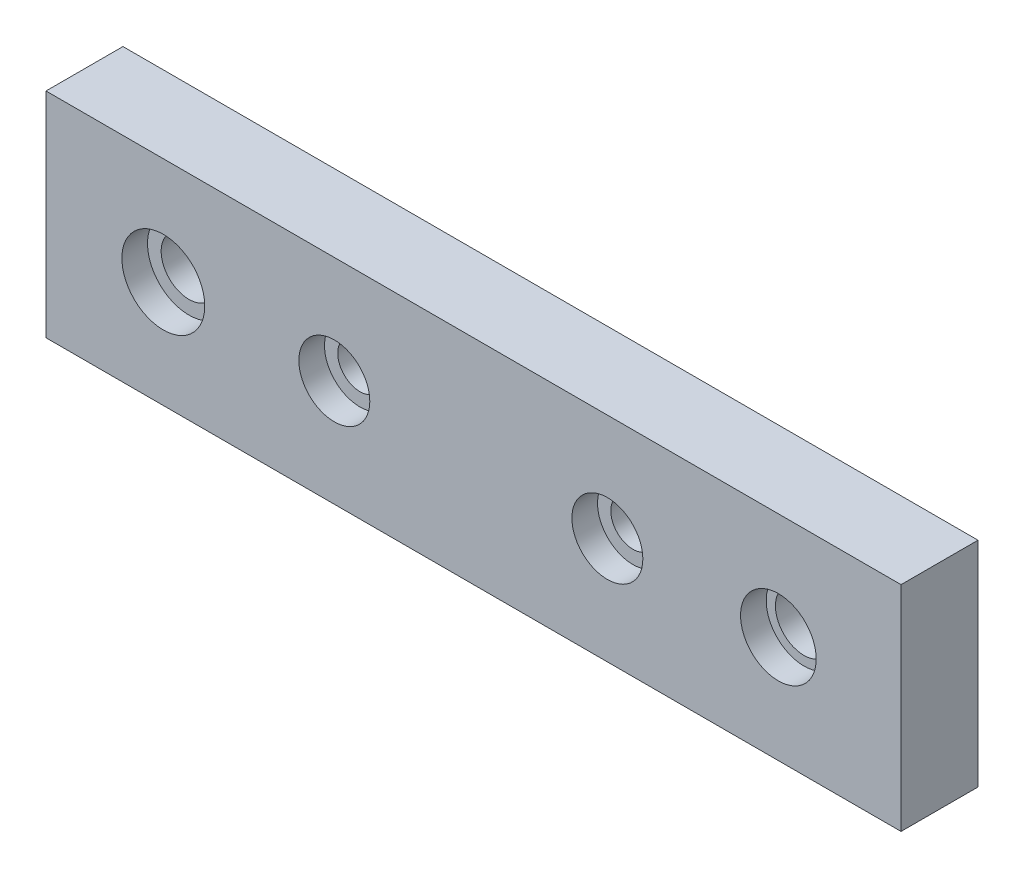
ISO-10303-21;
HEADER;
FILE_DESCRIPTION(('STEP AP214'),'2;1');
FILE_NAME('part.step','',(''),(''),'','','');
FILE_SCHEMA(('AUTOMOTIVE_DESIGN { 1 0 10303 214 1 1 1 1 }'));
ENDSEC;
DATA;
#1=APPLICATION_CONTEXT('core data for automotive mechanical design processes');
#2=APPLICATION_PROTOCOL_DEFINITION('international standard','automotive_design',2000,#1);
#3=PRODUCT_CONTEXT('',#1,'mechanical');
#4=PRODUCT('Part','Part','',(#3));
#5=PRODUCT_RELATED_PRODUCT_CATEGORY('part','',(#4));
#6=PRODUCT_DEFINITION_FORMATION('','',#4);
#7=PRODUCT_DEFINITION_CONTEXT('part definition',#1,'design');
#8=PRODUCT_DEFINITION('design','',#6,#7);
#9=PRODUCT_DEFINITION_SHAPE('','',#8);
#10=(LENGTH_UNIT() NAMED_UNIT(*) SI_UNIT(.MILLI.,.METRE.));
#11=(NAMED_UNIT(*) PLANE_ANGLE_UNIT() SI_UNIT($,.RADIAN.));
#12=(NAMED_UNIT(*) SI_UNIT($,.STERADIAN.) SOLID_ANGLE_UNIT());
#13=UNCERTAINTY_MEASURE_WITH_UNIT(LENGTH_MEASURE(1.E-05),#10,'distance_accuracy_value','');
#14=(GEOMETRIC_REPRESENTATION_CONTEXT(3) GLOBAL_UNCERTAINTY_ASSIGNED_CONTEXT((#13)) GLOBAL_UNIT_ASSIGNED_CONTEXT((#10,
#11,#12)) REPRESENTATION_CONTEXT('',''));
#15=CARTESIAN_POINT('',(0.,0.,0.));
#16=DIRECTION('',(0.,0.,1.));
#17=DIRECTION('',(1.,0.,0.));
#18=AXIS2_PLACEMENT_3D('',#15,#16,#17);
#19=CARTESIAN_POINT('',(-85.3473640143417,12.5,-75.));
#20=DIRECTION('',(0.,0.,1.));
#21=DIRECTION('',(1.,0.,0.));
#22=AXIS2_PLACEMENT_3D('',#19,#20,#21);
#23=CYLINDRICAL_SURFACE('',#22,3.34609875630122);
#24=CARTESIAN_POINT('',(-85.3473640143417,12.5,17.5));
#25=DIRECTION('',(0.,0.,1.));
#26=DIRECTION('',(1.,0.,0.));
#27=AXIS2_PLACEMENT_3D('',#24,#25,#26);
#28=CIRCLE('',#27,3.34609875630122);
#29=CARTESIAN_POINT('',(-82.0012652580405,12.5,17.5));
#30=VERTEX_POINT('',#29);
#31=EDGE_CURVE('E108',#30,#30,#28,.T.);
#32=ORIENTED_EDGE('',*,*,#31,.F.);
#33=EDGE_LOOP('',(#32));
#34=FACE_BOUND('',#33,.T.);
#35=CARTESIAN_POINT('',(-85.3473640143417,12.5,23.5));
#36=DIRECTION('',(0.,0.,1.));
#37=DIRECTION('',(1.,0.,0.));
#38=AXIS2_PLACEMENT_3D('',#35,#36,#37);
#39=CIRCLE('',#38,3.34609875630122);
#40=CARTESIAN_POINT('',(-82.0012652580405,12.5,23.5));
#41=VERTEX_POINT('',#40);
#42=EDGE_CURVE('E36',#41,#41,#39,.F.);
#43=ORIENTED_EDGE('',*,*,#42,.F.);
#44=EDGE_LOOP('',(#43));
#45=FACE_BOUND('',#44,.T.);
#46=ADVANCED_FACE('F32',(#34,#45),#23,.F.);
#47=CARTESIAN_POINT('',(-157.28059455583,12.5,-75.));
#48=DIRECTION('',(0.,0.,1.));
#49=DIRECTION('',(1.,0.,0.));
#50=AXIS2_PLACEMENT_3D('',#47,#48,#49);
#51=CYLINDRICAL_SURFACE('',#50,3.25257439357136);
#52=CARTESIAN_POINT('',(-157.28059455583,12.5,17.5));
#53=DIRECTION('',(0.,0.,1.));
#54=DIRECTION('',(1.,0.,0.));
#55=AXIS2_PLACEMENT_3D('',#52,#53,#54);
#56=CIRCLE('',#55,3.25257439357136);
#57=CARTESIAN_POINT('',(-154.028020162259,12.5,17.5));
#58=VERTEX_POINT('',#57);
#59=EDGE_CURVE('E111',#58,#58,#56,.T.);
#60=ORIENTED_EDGE('',*,*,#59,.F.);
#61=EDGE_LOOP('',(#60));
#62=FACE_BOUND('',#61,.T.);
#63=CARTESIAN_POINT('',(-157.28059455583,12.5,23.5));
#64=DIRECTION('',(0.,0.,1.));
#65=DIRECTION('',(1.,0.,0.));
#66=AXIS2_PLACEMENT_3D('',#63,#64,#65);
#67=CIRCLE('',#66,3.25257439357136);
#68=CARTESIAN_POINT('',(-154.028020162259,12.5,23.5));
#69=VERTEX_POINT('',#68);
#70=EDGE_CURVE('E125',#69,#69,#67,.F.);
#71=ORIENTED_EDGE('',*,*,#70,.F.);
#72=EDGE_LOOP('',(#71));
#73=FACE_BOUND('',#72,.T.);
#74=ADVANCED_FACE('F135',(#62,#73),#51,.F.);
#75=CARTESIAN_POINT('',(-105.347364014342,12.5,-75.));
#76=DIRECTION('',(0.,0.,1.));
#77=DIRECTION('',(1.,0.,0.));
#78=AXIS2_PLACEMENT_3D('',#75,#76,#77);
#79=CYLINDRICAL_SURFACE('',#78,2.6);
#80=CARTESIAN_POINT('',(-105.347364014342,12.5,17.5));
#81=DIRECTION('',(0.,0.,1.));
#82=DIRECTION('',(1.,0.,0.));
#83=AXIS2_PLACEMENT_3D('',#80,#81,#82);
#84=CIRCLE('',#83,2.6);
#85=CARTESIAN_POINT('',(-102.747364014342,12.5,17.5));
#86=VERTEX_POINT('',#85);
#87=EDGE_CURVE('E114',#86,#86,#84,.T.);
#88=ORIENTED_EDGE('',*,*,#87,.F.);
#89=EDGE_LOOP('',(#88));
#90=FACE_BOUND('',#89,.T.);
#91=CARTESIAN_POINT('',(-105.347364014342,12.5,23.5));
#92=DIRECTION('',(0.,0.,1.));
#93=DIRECTION('',(1.,0.,0.));
#94=AXIS2_PLACEMENT_3D('',#91,#92,#93);
#95=CIRCLE('',#94,2.6);
#96=CARTESIAN_POINT('',(-102.747364014342,12.5,23.5));
#97=VERTEX_POINT('',#96);
#98=EDGE_CURVE('E122',#97,#97,#95,.F.);
#99=ORIENTED_EDGE('',*,*,#98,.F.);
#100=EDGE_LOOP('',(#99));
#101=FACE_BOUND('',#100,.T.);
#102=ADVANCED_FACE('F141',(#90,#101),#79,.F.);
#103=CARTESIAN_POINT('',(-137.28059455583,12.5,-75.));
#104=DIRECTION('',(0.,0.,1.));
#105=DIRECTION('',(1.,0.,0.));
#106=AXIS2_PLACEMENT_3D('',#103,#104,#105);
#107=CYLINDRICAL_SURFACE('',#106,2.59999999999999);
#108=CARTESIAN_POINT('',(-137.28059455583,12.5,17.5));
#109=DIRECTION('',(0.,0.,1.));
#110=DIRECTION('',(1.,0.,0.));
#111=AXIS2_PLACEMENT_3D('',#108,#109,#110);
#112=CIRCLE('',#111,2.59999999999999);
#113=CARTESIAN_POINT('',(-134.68059455583,12.5,17.5));
#114=VERTEX_POINT('',#113);
#115=EDGE_CURVE('E102',#114,#114,#112,.T.);
#116=ORIENTED_EDGE('',*,*,#115,.F.);
#117=EDGE_LOOP('',(#116));
#118=FACE_BOUND('',#117,.T.);
#119=CARTESIAN_POINT('',(-137.28059455583,12.5,23.5));
#120=DIRECTION('',(0.,0.,1.));
#121=DIRECTION('',(1.,0.,0.));
#122=AXIS2_PLACEMENT_3D('',#119,#120,#121);
#123=CIRCLE('',#122,2.59999999999999);
#124=CARTESIAN_POINT('',(-134.68059455583,12.5,23.5));
#125=VERTEX_POINT('',#124);
#126=EDGE_CURVE('E119',#125,#125,#123,.F.);
#127=ORIENTED_EDGE('',*,*,#126,.F.);
#128=EDGE_LOOP('',(#127));
#129=FACE_BOUND('',#128,.T.);
#130=ADVANCED_FACE('F163',(#118,#129),#107,.F.);
#131=CARTESIAN_POINT('',(-71.,0.,26.5));
#132=DIRECTION('',(-1.,0.,0.));
#133=DIRECTION('',(0.,0.,1.));
#134=AXIS2_PLACEMENT_3D('',#131,#132,#133);
#135=PLANE('',#134);
#136=DIRECTION('',(0.,1.,0.));
#137=VECTOR('',#136,1.);
#138=CARTESIAN_POINT('',(-71.,0.,17.5));
#139=LINE('',#138,#137);
#140=CARTESIAN_POINT('',(-71.,0.,17.5));
#141=VERTEX_POINT('',#140);
#142=CARTESIAN_POINT('',(-71.,25.,17.5));
#143=VERTEX_POINT('',#142);
#144=EDGE_CURVE('E99',#141,#143,#139,.T.);
#145=ORIENTED_EDGE('',*,*,#144,.T.);
#146=DIRECTION('',(0.,0.,-1.));
#147=VECTOR('',#146,1.);
#148=CARTESIAN_POINT('',(-71.,25.,26.5));
#149=LINE('',#148,#147);
#150=CARTESIAN_POINT('',(-71.,25.,26.5));
#151=VERTEX_POINT('',#150);
#152=EDGE_CURVE('E11',#151,#143,#149,.T.);
#153=ORIENTED_EDGE('',*,*,#152,.F.);
#154=DIRECTION('',(0.,1.,0.));
#155=VECTOR('',#154,1.);
#156=CARTESIAN_POINT('',(-71.,0.,26.5));
#157=LINE('',#156,#155);
#158=CARTESIAN_POINT('',(-71.,0.,26.5));
#159=VERTEX_POINT('',#158);
#160=EDGE_CURVE('E86',#159,#151,#157,.T.);
#161=ORIENTED_EDGE('',*,*,#160,.F.);
#162=DIRECTION('',(0.,0.,-1.));
#163=VECTOR('',#162,1.);
#164=CARTESIAN_POINT('',(-71.,0.,26.5));
#165=LINE('',#164,#163);
#166=EDGE_CURVE('E95',#159,#141,#165,.T.);
#167=ORIENTED_EDGE('',*,*,#166,.T.);
#168=EDGE_LOOP('',(#145,#153,#161,#167));
#169=FACE_BOUND('',#168,.T.);
#170=ADVANCED_FACE('F34',(#169),#135,.F.);
#171=CARTESIAN_POINT('',(-71.,25.,26.5));
#172=DIRECTION('',(0.,-1.,0.));
#173=DIRECTION('',(0.,0.,-1.));
#174=AXIS2_PLACEMENT_3D('',#171,#172,#173);
#175=PLANE('',#174);
#176=DIRECTION('',(-1.,0.,0.));
#177=VECTOR('',#176,1.);
#178=CARTESIAN_POINT('',(-71.,25.,17.5));
#179=LINE('',#178,#177);
#180=CARTESIAN_POINT('',(-171.,25.,17.5));
#181=VERTEX_POINT('',#180);
#182=EDGE_CURVE('E90',#143,#181,#179,.T.);
#183=ORIENTED_EDGE('',*,*,#182,.T.);
#184=DIRECTION('',(0.,0.,-1.));
#185=VECTOR('',#184,1.);
#186=CARTESIAN_POINT('',(-171.,25.,26.5));
#187=LINE('',#186,#185);
#188=CARTESIAN_POINT('',(-171.,25.,26.5));
#189=VERTEX_POINT('',#188);
#190=EDGE_CURVE('E42',#189,#181,#187,.T.);
#191=ORIENTED_EDGE('',*,*,#190,.F.);
#192=DIRECTION('',(-1.,0.,0.));
#193=VECTOR('',#192,1.);
#194=CARTESIAN_POINT('',(-71.,25.,26.5));
#195=LINE('',#194,#193);
#196=EDGE_CURVE('E81',#151,#189,#195,.T.);
#197=ORIENTED_EDGE('',*,*,#196,.F.);
#198=ORIENTED_EDGE('',*,*,#152,.T.);
#199=EDGE_LOOP('',(#183,#191,#197,#198));
#200=FACE_BOUND('',#199,.T.);
#201=ADVANCED_FACE('F89',(#200),#175,.F.);
#202=CARTESIAN_POINT('',(-171.,25.,26.5));
#203=DIRECTION('',(1.,0.,0.));
#204=DIRECTION('',(0.,0.,-1.));
#205=AXIS2_PLACEMENT_3D('',#202,#203,#204);
#206=PLANE('',#205);
#207=DIRECTION('',(0.,-1.,0.));
#208=VECTOR('',#207,1.);
#209=CARTESIAN_POINT('',(-171.,25.,17.5));
#210=LINE('',#209,#208);
#211=CARTESIAN_POINT('',(-171.,0.,17.5));
#212=VERTEX_POINT('',#211);
#213=EDGE_CURVE('E68',#181,#212,#210,.T.);
#214=ORIENTED_EDGE('',*,*,#213,.T.);
#215=DIRECTION('',(0.,0.,-1.));
#216=VECTOR('',#215,1.);
#217=CARTESIAN_POINT('',(-171.,0.,26.5));
#218=LINE('',#217,#216);
#219=CARTESIAN_POINT('',(-171.,0.,26.5));
#220=VERTEX_POINT('',#219);
#221=EDGE_CURVE('E91',#220,#212,#218,.T.);
#222=ORIENTED_EDGE('',*,*,#221,.F.);
#223=DIRECTION('',(0.,-1.,0.));
#224=VECTOR('',#223,1.);
#225=CARTESIAN_POINT('',(-171.,25.,26.5));
#226=LINE('',#225,#224);
#227=EDGE_CURVE('E84',#189,#220,#226,.T.);
#228=ORIENTED_EDGE('',*,*,#227,.F.);
#229=ORIENTED_EDGE('',*,*,#190,.T.);
#230=EDGE_LOOP('',(#214,#222,#228,#229));
#231=FACE_BOUND('',#230,.T.);
#232=ADVANCED_FACE('F93',(#231),#206,.F.);
#233=CARTESIAN_POINT('',(-171.,0.,26.5));
#234=DIRECTION('',(0.,1.,0.));
#235=DIRECTION('',(-1.,0.,0.));
#236=AXIS2_PLACEMENT_3D('',#233,#234,#235);
#237=PLANE('',#236);
#238=DIRECTION('',(1.,0.,0.));
#239=VECTOR('',#238,1.);
#240=CARTESIAN_POINT('',(-171.,0.,17.5));
#241=LINE('',#240,#239);
#242=EDGE_CURVE('E74',#212,#141,#241,.T.);
#243=ORIENTED_EDGE('',*,*,#242,.T.);
#244=ORIENTED_EDGE('',*,*,#166,.F.);
#245=DIRECTION('',(1.,0.,0.));
#246=VECTOR('',#245,1.);
#247=CARTESIAN_POINT('',(-171.,0.,26.5));
#248=LINE('',#247,#246);
#249=EDGE_CURVE('E51',#220,#159,#248,.T.);
#250=ORIENTED_EDGE('',*,*,#249,.F.);
#251=ORIENTED_EDGE('',*,*,#221,.T.);
#252=EDGE_LOOP('',(#243,#244,#250,#251));
#253=FACE_BOUND('',#252,.T.);
#254=ADVANCED_FACE('F150',(#253),#237,.F.);
#255=CARTESIAN_POINT('',(0.,0.,26.5));
#256=DIRECTION('',(0.,0.,1.));
#257=DIRECTION('',(1.,0.,0.));
#258=AXIS2_PLACEMENT_3D('',#255,#256,#257);
#259=PLANE('',#258);
#260=CARTESIAN_POINT('',(-137.28059455583,12.5,26.5));
#261=DIRECTION('',(0.,0.,1.));
#262=DIRECTION('',(1.,0.,0.));
#263=AXIS2_PLACEMENT_3D('',#260,#261,#262);
#264=CIRCLE('',#263,4.14999999999998);
#265=CARTESIAN_POINT('',(-133.13059455583,12.5,26.5));
#266=VERTEX_POINT('',#265);
#267=EDGE_CURVE('E191',#266,#266,#264,.T.);
#268=ORIENTED_EDGE('',*,*,#267,.F.);
#269=EDGE_LOOP('',(#268));
#270=FACE_BOUND('',#269,.T.);
#271=CARTESIAN_POINT('',(-105.347364014342,12.5,26.5));
#272=DIRECTION('',(0.,0.,1.));
#273=DIRECTION('',(1.,0.,0.));
#274=AXIS2_PLACEMENT_3D('',#271,#272,#273);
#275=CIRCLE('',#274,4.15);
#276=CARTESIAN_POINT('',(-101.197364014342,12.5,26.5));
#277=VERTEX_POINT('',#276);
#278=EDGE_CURVE('E185',#277,#277,#275,.T.);
#279=ORIENTED_EDGE('',*,*,#278,.F.);
#280=EDGE_LOOP('',(#279));
#281=FACE_BOUND('',#280,.T.);
#282=CARTESIAN_POINT('',(-157.28059455583,12.5,26.5));
#283=DIRECTION('',(0.,0.,1.));
#284=DIRECTION('',(1.,0.,0.));
#285=AXIS2_PLACEMENT_3D('',#282,#283,#284);
#286=CIRCLE('',#285,4.84717741512217);
#287=CARTESIAN_POINT('',(-152.433417140708,12.5,26.5));
#288=VERTEX_POINT('',#287);
#289=EDGE_CURVE('E179',#288,#288,#286,.T.);
#290=ORIENTED_EDGE('',*,*,#289,.F.);
#291=EDGE_LOOP('',(#290));
#292=FACE_BOUND('',#291,.T.);
#293=CARTESIAN_POINT('',(-85.3473640143417,12.5,26.5));
#294=DIRECTION('',(0.,0.,1.));
#295=DIRECTION('',(1.,0.,0.));
#296=AXIS2_PLACEMENT_3D('',#293,#294,#295);
#297=CIRCLE('',#296,4.42349262464526);
#298=CARTESIAN_POINT('',(-80.9238713896965,12.5,26.5));
#299=VERTEX_POINT('',#298);
#300=EDGE_CURVE('E173',#299,#299,#297,.T.);
#301=ORIENTED_EDGE('',*,*,#300,.F.);
#302=EDGE_LOOP('',(#301));
#303=FACE_BOUND('',#302,.T.);
#304=ORIENTED_EDGE('',*,*,#160,.T.);
#305=ORIENTED_EDGE('',*,*,#196,.T.);
#306=ORIENTED_EDGE('',*,*,#227,.T.);
#307=ORIENTED_EDGE('',*,*,#249,.T.);
#308=EDGE_LOOP('',(#304,#305,#306,#307));
#309=FACE_BOUND('',#308,.T.);
#310=ADVANCED_FACE('F82',(#270,#281,#292,#303,#309),#259,.T.);
#311=CARTESIAN_POINT('',(0.,0.,17.5));
#312=DIRECTION('',(0.,0.,1.));
#313=DIRECTION('',(1.,0.,0.));
#314=AXIS2_PLACEMENT_3D('',#311,#312,#313);
#315=PLANE('',#314);
#316=ORIENTED_EDGE('',*,*,#115,.T.);
#317=EDGE_LOOP('',(#316));
#318=FACE_BOUND('',#317,.T.);
#319=ORIENTED_EDGE('',*,*,#87,.T.);
#320=EDGE_LOOP('',(#319));
#321=FACE_BOUND('',#320,.T.);
#322=ORIENTED_EDGE('',*,*,#59,.T.);
#323=EDGE_LOOP('',(#322));
#324=FACE_BOUND('',#323,.T.);
#325=ORIENTED_EDGE('',*,*,#31,.T.);
#326=EDGE_LOOP('',(#325));
#327=FACE_BOUND('',#326,.T.);
#328=ORIENTED_EDGE('',*,*,#144,.F.);
#329=ORIENTED_EDGE('',*,*,#242,.F.);
#330=ORIENTED_EDGE('',*,*,#213,.F.);
#331=ORIENTED_EDGE('',*,*,#182,.F.);
#332=EDGE_LOOP('',(#328,#329,#330,#331));
#333=FACE_BOUND('',#332,.T.);
#334=ADVANCED_FACE('F149',(#318,#321,#324,#327,#333),#315,.F.);
#335=CARTESIAN_POINT('',(-137.28059455583,12.5,23.5));
#336=DIRECTION('',(0.,0.,1.));
#337=DIRECTION('',(1.,0.,0.));
#338=AXIS2_PLACEMENT_3D('',#335,#336,#337);
#339=PLANE('',#338);
#340=CARTESIAN_POINT('',(-137.28059455583,12.5,23.5));
#341=DIRECTION('',(0.,0.,1.));
#342=DIRECTION('',(1.,0.,0.));
#343=AXIS2_PLACEMENT_3D('',#340,#341,#342);
#344=CIRCLE('',#343,4.14999999999998);
#345=CARTESIAN_POINT('',(-133.13059455583,12.5,23.5));
#346=VERTEX_POINT('',#345);
#347=EDGE_CURVE('E123',#346,#346,#344,.T.);
#348=ORIENTED_EDGE('',*,*,#347,.T.);
#349=EDGE_LOOP('',(#348));
#350=FACE_BOUND('',#349,.T.);
#351=ORIENTED_EDGE('',*,*,#126,.T.);
#352=EDGE_LOOP('',(#351));
#353=FACE_BOUND('',#352,.T.);
#354=ADVANCED_FACE('F154',(#350,#353),#339,.T.);
#355=CARTESIAN_POINT('',(-137.28059455583,12.5,23.5));
#356=DIRECTION('',(0.,0.,1.));
#357=DIRECTION('',(1.,0.,0.));
#358=AXIS2_PLACEMENT_3D('',#355,#356,#357);
#359=CYLINDRICAL_SURFACE('',#358,4.14999999999998);
#360=ORIENTED_EDGE('',*,*,#347,.F.);
#361=EDGE_LOOP('',(#360));
#362=FACE_BOUND('',#361,.T.);
#363=ORIENTED_EDGE('',*,*,#267,.T.);
#364=EDGE_LOOP('',(#363));
#365=FACE_BOUND('',#364,.T.);
#366=ADVANCED_FACE('F199',(#362,#365),#359,.F.);
#367=CARTESIAN_POINT('',(-105.347364014342,12.5,23.5));
#368=DIRECTION('',(0.,0.,1.));
#369=DIRECTION('',(1.,0.,0.));
#370=AXIS2_PLACEMENT_3D('',#367,#368,#369);
#371=PLANE('',#370);
#372=CARTESIAN_POINT('',(-105.347364014342,12.5,23.5));
#373=DIRECTION('',(0.,0.,1.));
#374=DIRECTION('',(1.,0.,0.));
#375=AXIS2_PLACEMENT_3D('',#372,#373,#374);
#376=CIRCLE('',#375,4.15);
#377=CARTESIAN_POINT('',(-101.197364014342,12.5,23.5));
#378=VERTEX_POINT('',#377);
#379=EDGE_CURVE('E188',#378,#378,#376,.T.);
#380=ORIENTED_EDGE('',*,*,#379,.T.);
#381=EDGE_LOOP('',(#380));
#382=FACE_BOUND('',#381,.T.);
#383=ORIENTED_EDGE('',*,*,#98,.T.);
#384=EDGE_LOOP('',(#383));
#385=FACE_BOUND('',#384,.T.);
#386=ADVANCED_FACE('F202',(#382,#385),#371,.T.);
#387=CARTESIAN_POINT('',(-105.347364014342,12.5,23.5));
#388=DIRECTION('',(0.,0.,1.));
#389=DIRECTION('',(1.,0.,0.));
#390=AXIS2_PLACEMENT_3D('',#387,#388,#389);
#391=CYLINDRICAL_SURFACE('',#390,4.15);
#392=ORIENTED_EDGE('',*,*,#379,.F.);
#393=EDGE_LOOP('',(#392));
#394=FACE_BOUND('',#393,.T.);
#395=ORIENTED_EDGE('',*,*,#278,.T.);
#396=EDGE_LOOP('',(#395));
#397=FACE_BOUND('',#396,.T.);
#398=ADVANCED_FACE('F233',(#394,#397),#391,.F.);
#399=CARTESIAN_POINT('',(-157.28059455583,12.5,23.5));
#400=DIRECTION('',(0.,0.,1.));
#401=DIRECTION('',(1.,0.,0.));
#402=AXIS2_PLACEMENT_3D('',#399,#400,#401);
#403=PLANE('',#402);
#404=CARTESIAN_POINT('',(-157.28059455583,12.5,23.5));
#405=DIRECTION('',(0.,0.,1.));
#406=DIRECTION('',(1.,0.,0.));
#407=AXIS2_PLACEMENT_3D('',#404,#405,#406);
#408=CIRCLE('',#407,4.84717741512217);
#409=CARTESIAN_POINT('',(-152.433417140708,12.5,23.5));
#410=VERTEX_POINT('',#409);
#411=EDGE_CURVE('E182',#410,#410,#408,.T.);
#412=ORIENTED_EDGE('',*,*,#411,.T.);
#413=EDGE_LOOP('',(#412));
#414=FACE_BOUND('',#413,.T.);
#415=ORIENTED_EDGE('',*,*,#70,.T.);
#416=EDGE_LOOP('',(#415));
#417=FACE_BOUND('',#416,.T.);
#418=ADVANCED_FACE('F239',(#414,#417),#403,.T.);
#419=CARTESIAN_POINT('',(-157.28059455583,12.5,23.5));
#420=DIRECTION('',(0.,0.,1.));
#421=DIRECTION('',(1.,0.,0.));
#422=AXIS2_PLACEMENT_3D('',#419,#420,#421);
#423=CYLINDRICAL_SURFACE('',#422,4.84717741512217);
#424=ORIENTED_EDGE('',*,*,#411,.F.);
#425=EDGE_LOOP('',(#424));
#426=FACE_BOUND('',#425,.T.);
#427=ORIENTED_EDGE('',*,*,#289,.T.);
#428=EDGE_LOOP('',(#427));
#429=FACE_BOUND('',#428,.T.);
#430=ADVANCED_FACE('F219',(#426,#429),#423,.F.);
#431=CARTESIAN_POINT('',(-85.3473640143417,12.5,23.5));
#432=DIRECTION('',(0.,0.,1.));
#433=DIRECTION('',(1.,0.,0.));
#434=AXIS2_PLACEMENT_3D('',#431,#432,#433);
#435=PLANE('',#434);
#436=CARTESIAN_POINT('',(-85.3473640143417,12.5,23.5));
#437=DIRECTION('',(0.,0.,1.));
#438=DIRECTION('',(1.,0.,0.));
#439=AXIS2_PLACEMENT_3D('',#436,#437,#438);
#440=CIRCLE('',#439,4.42349262464526);
#441=CARTESIAN_POINT('',(-80.9238713896965,12.5,23.5));
#442=VERTEX_POINT('',#441);
#443=EDGE_CURVE('E176',#442,#442,#440,.T.);
#444=ORIENTED_EDGE('',*,*,#443,.T.);
#445=EDGE_LOOP('',(#444));
#446=FACE_BOUND('',#445,.T.);
#447=ORIENTED_EDGE('',*,*,#42,.T.);
#448=EDGE_LOOP('',(#447));
#449=FACE_BOUND('',#448,.T.);
#450=ADVANCED_FACE('F132',(#446,#449),#435,.T.);
#451=CARTESIAN_POINT('',(-85.3473640143417,12.5,23.5));
#452=DIRECTION('',(0.,0.,1.));
#453=DIRECTION('',(1.,0.,0.));
#454=AXIS2_PLACEMENT_3D('',#451,#452,#453);
#455=CYLINDRICAL_SURFACE('',#454,4.42349262464526);
#456=ORIENTED_EDGE('',*,*,#443,.F.);
#457=EDGE_LOOP('',(#456));
#458=FACE_BOUND('',#457,.T.);
#459=ORIENTED_EDGE('',*,*,#300,.T.);
#460=EDGE_LOOP('',(#459));
#461=FACE_BOUND('',#460,.T.);
#462=ADVANCED_FACE('F212',(#458,#461),#455,.F.);
#463=CLOSED_SHELL('',(#46,#74,#102,#130,#170,#201,#232,#254,#310,#334,#354,#366,#386,#398,#418,
#430,#450,#462));
#464=MANIFOLD_SOLID_BREP('B2',#463);
#465=ADVANCED_BREP_SHAPE_REPRESENTATION('',(#18,#464),#14);
#466=SHAPE_DEFINITION_REPRESENTATION(#9,#465);
ENDSEC;
END-ISO-10303-21;
